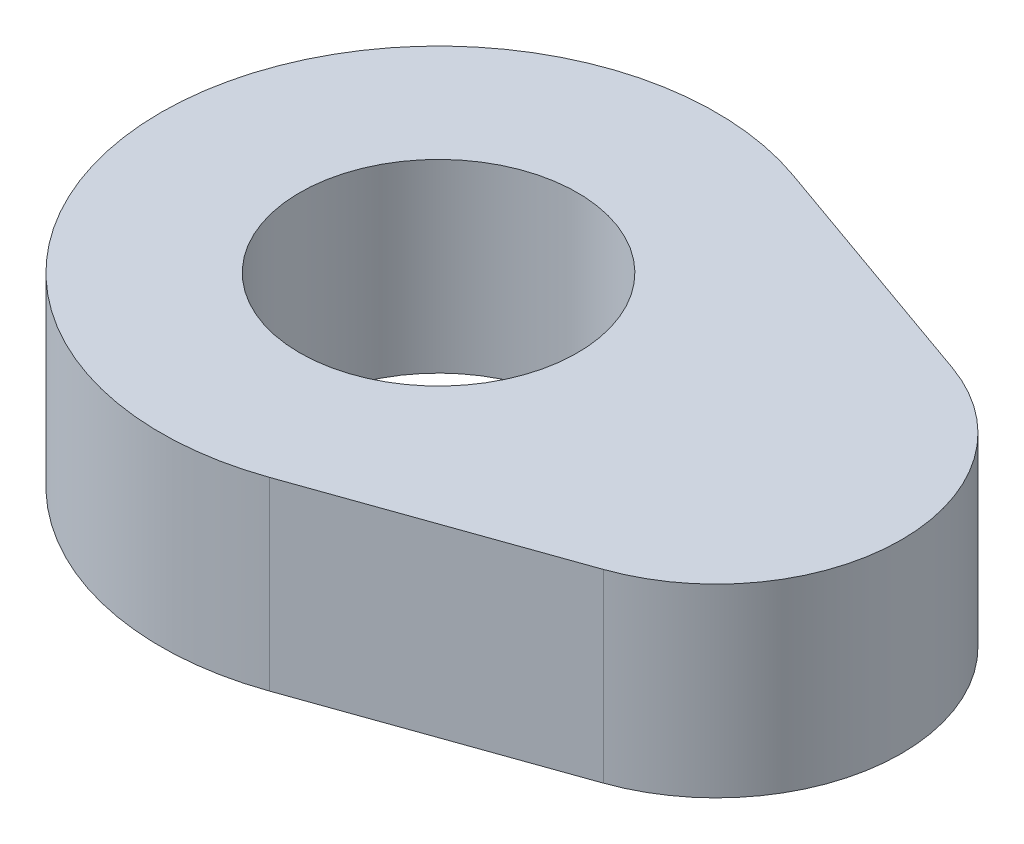
ISO-10303-21;
HEADER;
FILE_DESCRIPTION(('STEP AP214'),'2;1');
FILE_NAME('part.step','',(''),(''),'','','');
FILE_SCHEMA(('AUTOMOTIVE_DESIGN { 1 0 10303 214 1 1 1 1 }'));
ENDSEC;
DATA;
#1=APPLICATION_CONTEXT('core data for automotive mechanical design processes');
#2=APPLICATION_PROTOCOL_DEFINITION('international standard','automotive_design',2000,#1);
#3=PRODUCT_CONTEXT('',#1,'mechanical');
#4=PRODUCT('Part','Part','',(#3));
#5=PRODUCT_RELATED_PRODUCT_CATEGORY('part','',(#4));
#6=PRODUCT_DEFINITION_FORMATION('','',#4);
#7=PRODUCT_DEFINITION_CONTEXT('part definition',#1,'design');
#8=PRODUCT_DEFINITION('design','',#6,#7);
#9=PRODUCT_DEFINITION_SHAPE('','',#8);
#10=(LENGTH_UNIT() NAMED_UNIT(*) SI_UNIT(.MILLI.,.METRE.));
#11=(NAMED_UNIT(*) PLANE_ANGLE_UNIT() SI_UNIT($,.RADIAN.));
#12=(NAMED_UNIT(*) SI_UNIT($,.STERADIAN.) SOLID_ANGLE_UNIT());
#13=UNCERTAINTY_MEASURE_WITH_UNIT(LENGTH_MEASURE(1.E-05),#10,'distance_accuracy_value','');
#14=(GEOMETRIC_REPRESENTATION_CONTEXT(3) GLOBAL_UNCERTAINTY_ASSIGNED_CONTEXT((#13)) GLOBAL_UNIT_ASSIGNED_CONTEXT((#10,
#11,#12)) REPRESENTATION_CONTEXT('',''));
#15=CARTESIAN_POINT('',(0.,0.,0.));
#16=DIRECTION('',(0.,0.,1.));
#17=DIRECTION('',(1.,0.,0.));
#18=AXIS2_PLACEMENT_3D('',#15,#16,#17);
#19=CARTESIAN_POINT('',(-5.75985447681122,10.,4.18356955479051));
#20=DIRECTION('',(0.,-1.,0.));
#21=DIRECTION('',(0.,0.,-1.));
#22=AXIS2_PLACEMENT_3D('',#19,#20,#21);
#23=CYLINDRICAL_SURFACE('',#22,15.);
#24=CARTESIAN_POINT('',(-5.75985447681122,0.,4.18356955479051));
#25=DIRECTION('',(0.,1.,0.));
#26=DIRECTION('',(0.,0.,1.));
#27=AXIS2_PLACEMENT_3D('',#24,#25,#26);
#28=CIRCLE('',#27,15.);
#29=CARTESIAN_POINT('',(-0.759854476811215,0.,-9.95856606894044));
#30=VERTEX_POINT('',#29);
#31=CARTESIAN_POINT('',(-0.759854476811216,0.,18.3257051785215));
#32=VERTEX_POINT('',#31);
#33=EDGE_CURVE('E113',#30,#32,#28,.T.);
#34=ORIENTED_EDGE('',*,*,#33,.T.);
#35=DIRECTION('',(0.,-1.,0.));
#36=VECTOR('',#35,1.);
#37=CARTESIAN_POINT('',(-0.759854476811216,10.,18.3257051785215));
#38=LINE('',#37,#36);
#39=CARTESIAN_POINT('',(-0.759854476811216,10.,18.3257051785215));
#40=VERTEX_POINT('',#39);
#41=EDGE_CURVE('E11',#40,#32,#38,.T.);
#42=ORIENTED_EDGE('',*,*,#41,.F.);
#43=CARTESIAN_POINT('',(-5.75985447681122,10.,4.18356955479051));
#44=DIRECTION('',(0.,1.,0.));
#45=DIRECTION('',(0.,0.,1.));
#46=AXIS2_PLACEMENT_3D('',#43,#44,#45);
#47=CIRCLE('',#46,15.);
#48=CARTESIAN_POINT('',(-0.759854476811215,10.,-9.95856606894044));
#49=VERTEX_POINT('',#48);
#50=EDGE_CURVE('E97',#49,#40,#47,.T.);
#51=ORIENTED_EDGE('',*,*,#50,.F.);
#52=DIRECTION('',(0.,-1.,0.));
#53=VECTOR('',#52,1.);
#54=CARTESIAN_POINT('',(-0.759854476811215,10.,-9.95856606894044));
#55=LINE('',#54,#53);
#56=EDGE_CURVE('E109',#49,#30,#55,.T.);
#57=ORIENTED_EDGE('',*,*,#56,.T.);
#58=EDGE_LOOP('',(#34,#42,#51,#57));
#59=FACE_BOUND('',#58,.T.);
#60=ADVANCED_FACE('F45',(#59),#23,.T.);
#61=CARTESIAN_POINT('',(-0.759854476811216,10.,18.3257051785215));
#62=DIRECTION('',(-0.333333333333333,0.,-0.942809041582063));
#63=DIRECTION('',(-0.942809041582063,0.,0.333333333333333));
#64=AXIS2_PLACEMENT_3D('',#61,#62,#63);
#65=PLANE('',#64);
#66=DIRECTION('',(0.942809041582063,0.,-0.333333333333333));
#67=VECTOR('',#66,1.);
#68=CARTESIAN_POINT('',(-0.759854476811216,0.,18.3257051785215));
#69=LINE('',#68,#67);
#70=CARTESIAN_POINT('',(12.5734788565221,0.,13.6116599706111));
#71=VERTEX_POINT('',#70);
#72=EDGE_CURVE('E102',#32,#71,#69,.T.);
#73=ORIENTED_EDGE('',*,*,#72,.T.);
#74=DIRECTION('',(0.,-1.,0.));
#75=VECTOR('',#74,1.);
#76=CARTESIAN_POINT('',(12.5734788565221,10.,13.6116599706111));
#77=LINE('',#76,#75);
#78=CARTESIAN_POINT('',(12.5734788565221,10.,13.6116599706111));
#79=VERTEX_POINT('',#78);
#80=EDGE_CURVE('E54',#79,#71,#77,.T.);
#81=ORIENTED_EDGE('',*,*,#80,.F.);
#82=DIRECTION('',(0.942809041582063,0.,-0.333333333333333));
#83=VECTOR('',#82,1.);
#84=CARTESIAN_POINT('',(-0.759854476811216,10.,18.3257051785215));
#85=LINE('',#84,#83);
#86=EDGE_CURVE('E92',#40,#79,#85,.T.);
#87=ORIENTED_EDGE('',*,*,#86,.F.);
#88=ORIENTED_EDGE('',*,*,#41,.T.);
#89=EDGE_LOOP('',(#73,#81,#87,#88));
#90=FACE_BOUND('',#89,.T.);
#91=ADVANCED_FACE('F101',(#90),#65,.F.);
#92=CARTESIAN_POINT('',(9.24014552318878,10.,4.18356955479051));
#93=DIRECTION('',(0.,-1.,0.));
#94=DIRECTION('',(0.,0.,-1.));
#95=AXIS2_PLACEMENT_3D('',#92,#93,#94);
#96=CYLINDRICAL_SURFACE('',#95,10.);
#97=CARTESIAN_POINT('',(9.24014552318878,0.,4.18356955479051));
#98=DIRECTION('',(0.,1.,0.));
#99=DIRECTION('',(0.,0.,-1.));
#100=AXIS2_PLACEMENT_3D('',#97,#98,#99);
#101=CIRCLE('',#100,10.);
#102=CARTESIAN_POINT('',(12.5734788565221,0.,-5.24452086103013));
#103=VERTEX_POINT('',#102);
#104=EDGE_CURVE('E79',#71,#103,#101,.T.);
#105=ORIENTED_EDGE('',*,*,#104,.T.);
#106=DIRECTION('',(0.,-1.,0.));
#107=VECTOR('',#106,1.);
#108=CARTESIAN_POINT('',(12.5734788565221,10.,-5.24452086103013));
#109=LINE('',#108,#107);
#110=CARTESIAN_POINT('',(12.5734788565221,10.,-5.24452086103013));
#111=VERTEX_POINT('',#110);
#112=EDGE_CURVE('E104',#111,#103,#109,.T.);
#113=ORIENTED_EDGE('',*,*,#112,.F.);
#114=CARTESIAN_POINT('',(9.24014552318878,10.,4.18356955479051));
#115=DIRECTION('',(0.,1.,0.));
#116=DIRECTION('',(0.,0.,-1.));
#117=AXIS2_PLACEMENT_3D('',#114,#115,#116);
#118=CIRCLE('',#117,10.);
#119=EDGE_CURVE('E95',#79,#111,#118,.T.);
#120=ORIENTED_EDGE('',*,*,#119,.F.);
#121=ORIENTED_EDGE('',*,*,#80,.T.);
#122=EDGE_LOOP('',(#105,#113,#120,#121));
#123=FACE_BOUND('',#122,.T.);
#124=ADVANCED_FACE('F105',(#123),#96,.T.);
#125=CARTESIAN_POINT('',(-0.759854476811215,10.,-9.95856606894044));
#126=DIRECTION('',(-0.333333333333333,0.,0.942809041582063));
#127=DIRECTION('',(0.942809041582063,0.,0.333333333333333));
#128=AXIS2_PLACEMENT_3D('',#125,#126,#127);
#129=PLANE('',#128);
#130=DIRECTION('',(-0.942809041582063,0.,-0.333333333333333));
#131=VECTOR('',#130,1.);
#132=CARTESIAN_POINT('',(-0.759854476811215,0.,-9.95856606894044));
#133=LINE('',#132,#131);
#134=EDGE_CURVE('E85',#103,#30,#133,.T.);
#135=ORIENTED_EDGE('',*,*,#134,.T.);
#136=ORIENTED_EDGE('',*,*,#56,.F.);
#137=DIRECTION('',(-0.942809041582063,0.,-0.333333333333333));
#138=VECTOR('',#137,1.);
#139=CARTESIAN_POINT('',(-0.759854476811215,10.,-9.95856606894044));
#140=LINE('',#139,#138);
#141=EDGE_CURVE('E62',#111,#49,#140,.T.);
#142=ORIENTED_EDGE('',*,*,#141,.F.);
#143=ORIENTED_EDGE('',*,*,#112,.T.);
#144=EDGE_LOOP('',(#135,#136,#142,#143));
#145=FACE_BOUND('',#144,.T.);
#146=ADVANCED_FACE('F127',(#145),#129,.F.);
#147=CARTESIAN_POINT('',(-5.75985447681122,10.,4.18356955479051));
#148=DIRECTION('',(0.,1.,0.));
#149=DIRECTION('',(0.,0.,1.));
#150=AXIS2_PLACEMENT_3D('',#147,#148,#149);
#151=PLANE('',#150);
#152=CARTESIAN_POINT('',(-5.7598544768115,10.,4.1835695547907));
#153=DIRECTION('',(0.,1.,0.));
#154=DIRECTION('',(0.,0.,1.));
#155=AXIS2_PLACEMENT_3D('',#152,#153,#154);
#156=CIRCLE('',#155,7.5);
#157=CARTESIAN_POINT('',(-5.7598544768115,10.,11.6835695547907));
#158=VERTEX_POINT('',#157);
#159=EDGE_CURVE('E134',#158,#158,#156,.T.);
#160=ORIENTED_EDGE('',*,*,#159,.F.);
#161=EDGE_LOOP('',(#160));
#162=FACE_BOUND('',#161,.T.);
#163=ORIENTED_EDGE('',*,*,#50,.T.);
#164=ORIENTED_EDGE('',*,*,#86,.T.);
#165=ORIENTED_EDGE('',*,*,#119,.T.);
#166=ORIENTED_EDGE('',*,*,#141,.T.);
#167=EDGE_LOOP('',(#163,#164,#165,#166));
#168=FACE_BOUND('',#167,.T.);
#169=ADVANCED_FACE('F93',(#162,#168),#151,.T.);
#170=CARTESIAN_POINT('',(-5.75985447681122,0.,4.18356955479051));
#171=DIRECTION('',(0.,1.,0.));
#172=DIRECTION('',(0.,0.,1.));
#173=AXIS2_PLACEMENT_3D('',#170,#171,#172);
#174=PLANE('',#173);
#175=CARTESIAN_POINT('',(-5.7598544768115,0.,4.1835695547907));
#176=DIRECTION('',(0.,1.,0.));
#177=DIRECTION('',(0.,0.,1.));
#178=AXIS2_PLACEMENT_3D('',#175,#176,#177);
#179=CIRCLE('',#178,7.5);
#180=CARTESIAN_POINT('',(-5.7598544768115,0.,11.6835695547907));
#181=VERTEX_POINT('',#180);
#182=EDGE_CURVE('E117',#181,#181,#179,.T.);
#183=ORIENTED_EDGE('',*,*,#182,.T.);
#184=EDGE_LOOP('',(#183));
#185=FACE_BOUND('',#184,.T.);
#186=ORIENTED_EDGE('',*,*,#33,.F.);
#187=ORIENTED_EDGE('',*,*,#134,.F.);
#188=ORIENTED_EDGE('',*,*,#104,.F.);
#189=ORIENTED_EDGE('',*,*,#72,.F.);
#190=EDGE_LOOP('',(#186,#187,#188,#189));
#191=FACE_BOUND('',#190,.T.);
#192=ADVANCED_FACE('F130',(#185,#191),#174,.F.);
#193=CARTESIAN_POINT('',(-5.7598544768115,0.,4.1835695547907));
#194=DIRECTION('',(0.,1.,0.));
#195=DIRECTION('',(0.,0.,1.));
#196=AXIS2_PLACEMENT_3D('',#193,#194,#195);
#197=CYLINDRICAL_SURFACE('',#196,7.5);
#198=ORIENTED_EDGE('',*,*,#182,.F.);
#199=EDGE_LOOP('',(#198));
#200=FACE_BOUND('',#199,.T.);
#201=ORIENTED_EDGE('',*,*,#159,.T.);
#202=EDGE_LOOP('',(#201));
#203=FACE_BOUND('',#202,.T.);
#204=ADVANCED_FACE('F143',(#200,#203),#197,.F.);
#205=CLOSED_SHELL('',(#60,#91,#124,#146,#169,#192,#204));
#206=MANIFOLD_SOLID_BREP('B2',#205);
#207=ADVANCED_BREP_SHAPE_REPRESENTATION('',(#18,#206),#14);
#208=SHAPE_DEFINITION_REPRESENTATION(#9,#207);
ENDSEC;
END-ISO-10303-21;
